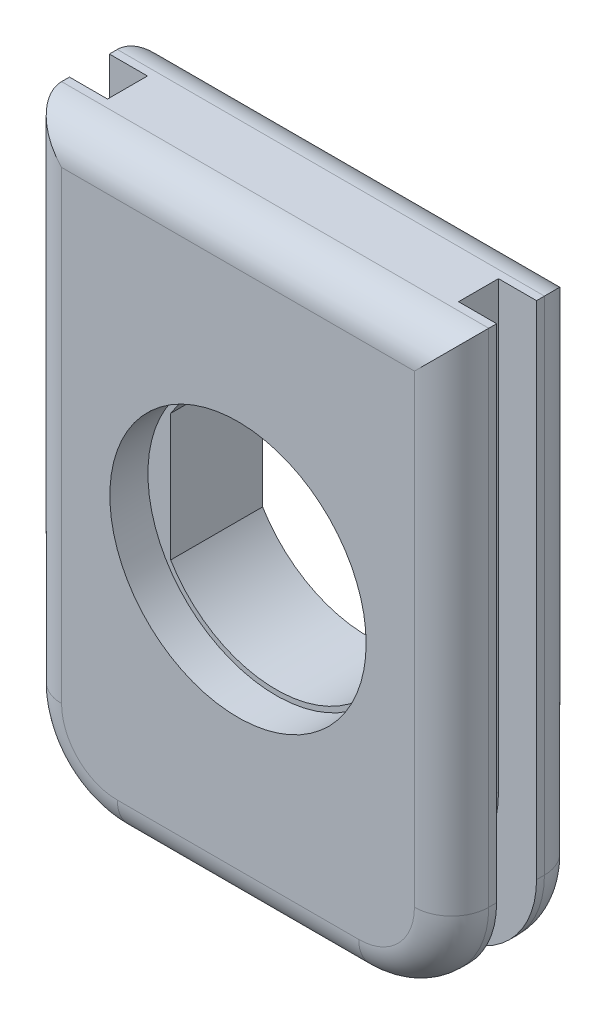
ISO-10303-21;
HEADER;
FILE_DESCRIPTION(('STEP AP214'),'2;1');
FILE_NAME('part.step','',(''),(''),'','','');
FILE_SCHEMA(('AUTOMOTIVE_DESIGN { 1 0 10303 214 1 1 1 1 }'));
ENDSEC;
DATA;
#1=APPLICATION_CONTEXT('core data for automotive mechanical design processes');
#2=APPLICATION_PROTOCOL_DEFINITION('international standard','automotive_design',2000,#1);
#3=PRODUCT_CONTEXT('',#1,'mechanical');
#4=PRODUCT('Part','Part','',(#3));
#5=PRODUCT_RELATED_PRODUCT_CATEGORY('part','',(#4));
#6=PRODUCT_DEFINITION_FORMATION('','',#4);
#7=PRODUCT_DEFINITION_CONTEXT('part definition',#1,'design');
#8=PRODUCT_DEFINITION('design','',#6,#7);
#9=PRODUCT_DEFINITION_SHAPE('','',#8);
#10=(LENGTH_UNIT() NAMED_UNIT(*) SI_UNIT(.MILLI.,.METRE.));
#11=(NAMED_UNIT(*) PLANE_ANGLE_UNIT() SI_UNIT($,.RADIAN.));
#12=(NAMED_UNIT(*) SI_UNIT($,.STERADIAN.) SOLID_ANGLE_UNIT());
#13=UNCERTAINTY_MEASURE_WITH_UNIT(LENGTH_MEASURE(1.E-05),#10,'distance_accuracy_value','');
#14=(GEOMETRIC_REPRESENTATION_CONTEXT(3) GLOBAL_UNCERTAINTY_ASSIGNED_CONTEXT((#13)) GLOBAL_UNIT_ASSIGNED_CONTEXT((#10,
#11,#12)) REPRESENTATION_CONTEXT('',''));
#15=CARTESIAN_POINT('',(0.,0.,0.));
#16=DIRECTION('',(0.,0.,1.));
#17=DIRECTION('',(1.,0.,0.));
#18=AXIS2_PLACEMENT_3D('',#15,#16,#17);
#19=CARTESIAN_POINT('',(0.,0.,-3.5));
#20=DIRECTION('',(0.,0.,1.));
#21=DIRECTION('',(1.,0.,0.));
#22=AXIS2_PLACEMENT_3D('',#19,#20,#21);
#23=CYLINDRICAL_SURFACE('',#22,6.625);
#24=CARTESIAN_POINT('',(0.,0.,1.45));
#25=DIRECTION('',(0.,0.,1.));
#26=DIRECTION('',(1.,0.,0.));
#27=AXIS2_PLACEMENT_3D('',#24,#25,#26);
#28=CIRCLE('',#27,6.625);
#29=CARTESIAN_POINT('',(-5.675,3.41833292702744,1.45));
#30=VERTEX_POINT('',#29);
#31=CARTESIAN_POINT('',(5.675,3.41833292702744,1.45));
#32=VERTEX_POINT('',#31);
#33=EDGE_CURVE('E221',#30,#32,#28,.F.);
#34=ORIENTED_EDGE('',*,*,#33,.F.);
#35=DIRECTION('',(0.,0.,1.));
#36=VECTOR('',#35,1.);
#37=CARTESIAN_POINT('',(-5.675,3.41833292702744,-3.5));
#38=LINE('',#37,#36);
#39=CARTESIAN_POINT('',(-5.675,3.41833292702744,-3.5));
#40=VERTEX_POINT('',#39);
#41=EDGE_CURVE('E228',#40,#30,#38,.T.);
#42=ORIENTED_EDGE('',*,*,#41,.F.);
#43=CARTESIAN_POINT('',(0.,0.,-3.5));
#44=DIRECTION('',(0.,0.,1.));
#45=DIRECTION('',(1.,0.,0.));
#46=AXIS2_PLACEMENT_3D('',#43,#44,#45);
#47=CIRCLE('',#46,6.625);
#48=CARTESIAN_POINT('',(5.675,3.41833292702744,-3.5));
#49=VERTEX_POINT('',#48);
#50=EDGE_CURVE('E231',#49,#40,#47,.T.);
#51=ORIENTED_EDGE('',*,*,#50,.F.);
#52=DIRECTION('',(0.,0.,1.));
#53=VECTOR('',#52,1.);
#54=CARTESIAN_POINT('',(5.675,3.41833292702744,-3.5));
#55=LINE('',#54,#53);
#56=EDGE_CURVE('E230',#49,#32,#55,.T.);
#57=ORIENTED_EDGE('',*,*,#56,.T.);
#58=EDGE_LOOP('',(#34,#42,#51,#57));
#59=FACE_BOUND('',#58,.T.);
#60=ADVANCED_FACE('F37',(#59),#23,.F.);
#61=CARTESIAN_POINT('',(5.675,3.41833292702744,-3.5));
#62=DIRECTION('',(1.,0.,0.));
#63=DIRECTION('',(0.,0.,-1.));
#64=AXIS2_PLACEMENT_3D('',#61,#62,#63);
#65=PLANE('',#64);
#66=DIRECTION('',(0.,-1.,0.));
#67=VECTOR('',#66,1.);
#68=CARTESIAN_POINT('',(5.675,3.41833292702744,1.45));
#69=LINE('',#68,#67);
#70=CARTESIAN_POINT('',(5.675,-3.41833292702744,1.45));
#71=VERTEX_POINT('',#70);
#72=EDGE_CURVE('E232',#32,#71,#69,.T.);
#73=ORIENTED_EDGE('',*,*,#72,.F.);
#74=ORIENTED_EDGE('',*,*,#56,.F.);
#75=DIRECTION('',(0.,1.,0.));
#76=VECTOR('',#75,1.);
#77=CARTESIAN_POINT('',(5.675,3.41833292702744,-3.5));
#78=LINE('',#77,#76);
#79=CARTESIAN_POINT('',(5.675,-3.41833292702744,-3.5));
#80=VERTEX_POINT('',#79);
#81=EDGE_CURVE('E239',#80,#49,#78,.T.);
#82=ORIENTED_EDGE('',*,*,#81,.F.);
#83=DIRECTION('',(0.,0.,1.));
#84=VECTOR('',#83,1.);
#85=CARTESIAN_POINT('',(5.675,-3.41833292702744,-3.5));
#86=LINE('',#85,#84);
#87=EDGE_CURVE('E241',#80,#71,#86,.T.);
#88=ORIENTED_EDGE('',*,*,#87,.T.);
#89=EDGE_LOOP('',(#73,#74,#82,#88));
#90=FACE_BOUND('',#89,.T.);
#91=ADVANCED_FACE('F493',(#90),#65,.F.);
#92=CARTESIAN_POINT('',(0.,0.,-3.5));
#93=DIRECTION('',(0.,0.,1.));
#94=DIRECTION('',(1.,0.,0.));
#95=AXIS2_PLACEMENT_3D('',#92,#93,#94);
#96=CYLINDRICAL_SURFACE('',#95,6.625);
#97=CARTESIAN_POINT('',(0.,0.,1.45));
#98=DIRECTION('',(0.,0.,1.));
#99=DIRECTION('',(1.,0.,0.));
#100=AXIS2_PLACEMENT_3D('',#97,#98,#99);
#101=CIRCLE('',#100,6.625);
#102=CARTESIAN_POINT('',(-5.675,-3.41833292702744,1.45));
#103=VERTEX_POINT('',#102);
#104=EDGE_CURVE('E51',#71,#103,#101,.F.);
#105=ORIENTED_EDGE('',*,*,#104,.F.);
#106=ORIENTED_EDGE('',*,*,#87,.F.);
#107=CARTESIAN_POINT('',(0.,0.,-3.5));
#108=DIRECTION('',(0.,0.,1.));
#109=DIRECTION('',(1.,0.,0.));
#110=AXIS2_PLACEMENT_3D('',#107,#108,#109);
#111=CIRCLE('',#110,6.625);
#112=CARTESIAN_POINT('',(-5.675,-3.41833292702744,-3.5));
#113=VERTEX_POINT('',#112);
#114=EDGE_CURVE('E59',#113,#80,#111,.T.);
#115=ORIENTED_EDGE('',*,*,#114,.F.);
#116=DIRECTION('',(0.,0.,1.));
#117=VECTOR('',#116,1.);
#118=CARTESIAN_POINT('',(-5.675,-3.41833292702744,-3.5));
#119=LINE('',#118,#117);
#120=EDGE_CURVE('E238',#113,#103,#119,.T.);
#121=ORIENTED_EDGE('',*,*,#120,.T.);
#122=EDGE_LOOP('',(#105,#106,#115,#121));
#123=FACE_BOUND('',#122,.T.);
#124=ADVANCED_FACE('F498',(#123),#96,.F.);
#125=CARTESIAN_POINT('',(-5.675,3.41833292702744,-3.5));
#126=DIRECTION('',(-1.,0.,0.));
#127=DIRECTION('',(0.,0.,1.));
#128=AXIS2_PLACEMENT_3D('',#125,#126,#127);
#129=PLANE('',#128);
#130=DIRECTION('',(0.,1.,0.));
#131=VECTOR('',#130,1.);
#132=CARTESIAN_POINT('',(-5.675,3.41833292702744,1.45));
#133=LINE('',#132,#131);
#134=EDGE_CURVE('E11',#103,#30,#133,.T.);
#135=ORIENTED_EDGE('',*,*,#134,.F.);
#136=ORIENTED_EDGE('',*,*,#120,.F.);
#137=DIRECTION('',(0.,-1.,0.));
#138=VECTOR('',#137,1.);
#139=CARTESIAN_POINT('',(-5.675,3.41833292702744,-3.5));
#140=LINE('',#139,#138);
#141=EDGE_CURVE('E236',#40,#113,#140,.T.);
#142=ORIENTED_EDGE('',*,*,#141,.F.);
#143=ORIENTED_EDGE('',*,*,#41,.T.);
#144=EDGE_LOOP('',(#135,#136,#142,#143));
#145=FACE_BOUND('',#144,.T.);
#146=ADVANCED_FACE('F234',(#145),#129,.F.);
#147=CARTESIAN_POINT('',(-11.5,16.,3.5));
#148=DIRECTION('',(1.,0.,0.));
#149=DIRECTION('',(0.,1.,0.));
#150=AXIS2_PLACEMENT_3D('',#147,#148,#149);
#151=PLANE('',#150);
#152=DIRECTION('',(0.,0.,-1.));
#153=VECTOR('',#152,1.);
#154=CARTESIAN_POINT('',(-11.5,16.,3.5));
#155=LINE('',#154,#153);
#156=CARTESIAN_POINT('',(-11.5,16.,-1.075));
#157=VERTEX_POINT('',#156);
#158=CARTESIAN_POINT('',(-11.5,16.,-1.5));
#159=VERTEX_POINT('',#158);
#160=EDGE_CURVE('E296',#157,#159,#155,.T.);
#161=ORIENTED_EDGE('',*,*,#160,.T.);
#162=DIRECTION('',(0.,-1.,0.));
#163=VECTOR('',#162,1.);
#164=CARTESIAN_POINT('',(-11.5,-11.,-1.5));
#165=LINE('',#164,#163);
#166=CARTESIAN_POINT('',(-11.5,-11.,-1.5));
#167=VERTEX_POINT('',#166);
#168=EDGE_CURVE('E372',#159,#167,#165,.T.);
#169=ORIENTED_EDGE('',*,*,#168,.T.);
#170=DIRECTION('',(0.,0.,-1.));
#171=VECTOR('',#170,1.);
#172=CARTESIAN_POINT('',(-11.5,-11.,3.5));
#173=LINE('',#172,#171);
#174=CARTESIAN_POINT('',(-11.5,-11.,-1.075));
#175=VERTEX_POINT('',#174);
#176=EDGE_CURVE('E326',#167,#175,#173,.F.);
#177=ORIENTED_EDGE('',*,*,#176,.T.);
#178=DIRECTION('',(0.,-1.,0.));
#179=VECTOR('',#178,1.);
#180=CARTESIAN_POINT('',(-11.5,16.,-1.075));
#181=LINE('',#180,#179);
#182=EDGE_CURVE('E247',#157,#175,#181,.T.);
#183=ORIENTED_EDGE('',*,*,#182,.F.);
#184=EDGE_LOOP('',(#161,#169,#177,#183));
#185=FACE_BOUND('',#184,.T.);
#186=ADVANCED_FACE('F542',(#185),#151,.F.);
#187=CARTESIAN_POINT('',(11.5,-16.,3.5));
#188=DIRECTION('',(0.,1.,0.));
#189=DIRECTION('',(0.,0.,1.));
#190=AXIS2_PLACEMENT_3D('',#187,#188,#189);
#191=PLANE('',#190);
#192=DIRECTION('',(0.,0.,-1.));
#193=VECTOR('',#192,1.);
#194=CARTESIAN_POINT('',(-6.5,-16.,3.5));
#195=LINE('',#194,#193);
#196=CARTESIAN_POINT('',(-6.5,-16.,-1.075));
#197=VERTEX_POINT('',#196);
#198=CARTESIAN_POINT('',(-6.5,-16.,-1.5));
#199=VERTEX_POINT('',#198);
#200=EDGE_CURVE('E323',#197,#199,#195,.T.);
#201=ORIENTED_EDGE('',*,*,#200,.T.);
#202=DIRECTION('',(1.,0.,0.));
#203=VECTOR('',#202,1.);
#204=CARTESIAN_POINT('',(6.50000000000001,-16.,-1.5));
#205=LINE('',#204,#203);
#206=CARTESIAN_POINT('',(6.50000000000001,-16.,-1.5));
#207=VERTEX_POINT('',#206);
#208=EDGE_CURVE('E376',#199,#207,#205,.T.);
#209=ORIENTED_EDGE('',*,*,#208,.T.);
#210=DIRECTION('',(0.,0.,-1.));
#211=VECTOR('',#210,1.);
#212=CARTESIAN_POINT('',(6.50000000000001,-16.,3.5));
#213=LINE('',#212,#211);
#214=CARTESIAN_POINT('',(6.50000000000001,-16.,-1.075));
#215=VERTEX_POINT('',#214);
#216=EDGE_CURVE('E321',#207,#215,#213,.F.);
#217=ORIENTED_EDGE('',*,*,#216,.T.);
#218=DIRECTION('',(1.,0.,0.));
#219=VECTOR('',#218,1.);
#220=CARTESIAN_POINT('',(-11.5,-16.,-1.075));
#221=LINE('',#220,#219);
#222=EDGE_CURVE('E250',#197,#215,#221,.T.);
#223=ORIENTED_EDGE('',*,*,#222,.F.);
#224=EDGE_LOOP('',(#201,#209,#217,#223));
#225=FACE_BOUND('',#224,.T.);
#226=ADVANCED_FACE('F538',(#225),#191,.F.);
#227=CARTESIAN_POINT('',(11.5,16.,3.5));
#228=DIRECTION('',(-1.,0.,0.));
#229=DIRECTION('',(0.,-1.,0.));
#230=AXIS2_PLACEMENT_3D('',#227,#228,#229);
#231=PLANE('',#230);
#232=DIRECTION('',(0.,0.,-1.));
#233=VECTOR('',#232,1.);
#234=CARTESIAN_POINT('',(11.5,-11.,3.5));
#235=LINE('',#234,#233);
#236=CARTESIAN_POINT('',(11.5,-11.,-1.075));
#237=VERTEX_POINT('',#236);
#238=CARTESIAN_POINT('',(11.5,-11.,-1.5));
#239=VERTEX_POINT('',#238);
#240=EDGE_CURVE('E346',#237,#239,#235,.T.);
#241=ORIENTED_EDGE('',*,*,#240,.T.);
#242=DIRECTION('',(0.,1.,0.));
#243=VECTOR('',#242,1.);
#244=CARTESIAN_POINT('',(11.5,16.,-1.5));
#245=LINE('',#244,#243);
#246=CARTESIAN_POINT('',(11.5,16.,-1.5));
#247=VERTEX_POINT('',#246);
#248=EDGE_CURVE('E365',#239,#247,#245,.T.);
#249=ORIENTED_EDGE('',*,*,#248,.T.);
#250=DIRECTION('',(0.,0.,-1.));
#251=VECTOR('',#250,1.);
#252=CARTESIAN_POINT('',(11.5,16.,3.5));
#253=LINE('',#252,#251);
#254=CARTESIAN_POINT('',(11.5,16.,-1.075));
#255=VERTEX_POINT('',#254);
#256=EDGE_CURVE('E300',#255,#247,#253,.T.);
#257=ORIENTED_EDGE('',*,*,#256,.F.);
#258=DIRECTION('',(0.,1.,0.));
#259=VECTOR('',#258,1.);
#260=CARTESIAN_POINT('',(11.5,-16.,-1.075));
#261=LINE('',#260,#259);
#262=EDGE_CURVE('E254',#237,#255,#261,.T.);
#263=ORIENTED_EDGE('',*,*,#262,.F.);
#264=EDGE_LOOP('',(#241,#249,#257,#263));
#265=FACE_BOUND('',#264,.T.);
#266=ADVANCED_FACE('F533',(#265),#231,.F.);
#267=CARTESIAN_POINT('',(11.5,16.,3.5));
#268=DIRECTION('',(0.,-1.,0.));
#269=DIRECTION('',(0.,0.,-1.));
#270=AXIS2_PLACEMENT_3D('',#267,#268,#269);
#271=PLANE('',#270);
#272=ORIENTED_EDGE('',*,*,#256,.T.);
#273=DIRECTION('',(-1.,0.,0.));
#274=VECTOR('',#273,1.);
#275=CARTESIAN_POINT('',(-11.5,16.,-1.5));
#276=LINE('',#275,#274);
#277=EDGE_CURVE('E370',#247,#159,#276,.T.);
#278=ORIENTED_EDGE('',*,*,#277,.T.);
#279=ORIENTED_EDGE('',*,*,#160,.F.);
#280=DIRECTION('',(-1.,0.,0.));
#281=VECTOR('',#280,1.);
#282=CARTESIAN_POINT('',(-9.45,16.,-1.075));
#283=LINE('',#282,#281);
#284=CARTESIAN_POINT('',(-9.45,16.,-1.075));
#285=VERTEX_POINT('',#284);
#286=EDGE_CURVE('E267',#285,#157,#283,.T.);
#287=ORIENTED_EDGE('',*,*,#286,.F.);
#288=DIRECTION('',(0.,0.,1.));
#289=VECTOR('',#288,1.);
#290=CARTESIAN_POINT('',(-9.45,16.,-1.075));
#291=LINE('',#290,#289);
#292=CARTESIAN_POINT('',(-9.45,16.,1.075));
#293=VERTEX_POINT('',#292);
#294=EDGE_CURVE('E293',#285,#293,#291,.T.);
#295=ORIENTED_EDGE('',*,*,#294,.T.);
#296=DIRECTION('',(-1.,0.,0.));
#297=VECTOR('',#296,1.);
#298=CARTESIAN_POINT('',(-9.45,16.,1.075));
#299=LINE('',#298,#297);
#300=CARTESIAN_POINT('',(-11.5,16.,1.075));
#301=VERTEX_POINT('',#300);
#302=EDGE_CURVE('E251',#293,#301,#299,.T.);
#303=ORIENTED_EDGE('',*,*,#302,.T.);
#304=CARTESIAN_POINT('',(-11.5,16.,1.5));
#305=VERTEX_POINT('',#304);
#306=EDGE_CURVE('E298',#305,#301,#155,.T.);
#307=ORIENTED_EDGE('',*,*,#306,.F.);
#308=DIRECTION('',(-1.,0.,0.));
#309=VECTOR('',#308,1.);
#310=CARTESIAN_POINT('',(11.5,16.,1.5));
#311=LINE('',#310,#309);
#312=CARTESIAN_POINT('',(11.5,16.,1.5));
#313=VERTEX_POINT('',#312);
#314=EDGE_CURVE('E367',#305,#313,#311,.F.);
#315=ORIENTED_EDGE('',*,*,#314,.T.);
#316=CARTESIAN_POINT('',(11.5,16.,1.075));
#317=VERTEX_POINT('',#316);
#318=EDGE_CURVE('E301',#313,#317,#253,.T.);
#319=ORIENTED_EDGE('',*,*,#318,.T.);
#320=DIRECTION('',(-1.,0.,0.));
#321=VECTOR('',#320,1.);
#322=CARTESIAN_POINT('',(9.45,16.,1.075));
#323=LINE('',#322,#321);
#324=CARTESIAN_POINT('',(9.45,16.,1.075));
#325=VERTEX_POINT('',#324);
#326=EDGE_CURVE('E280',#317,#325,#323,.T.);
#327=ORIENTED_EDGE('',*,*,#326,.T.);
#328=DIRECTION('',(0.,0.,1.));
#329=VECTOR('',#328,1.);
#330=CARTESIAN_POINT('',(9.45,16.,-1.075));
#331=LINE('',#330,#329);
#332=CARTESIAN_POINT('',(9.45,16.,-1.075));
#333=VERTEX_POINT('',#332);
#334=EDGE_CURVE('E269',#333,#325,#331,.T.);
#335=ORIENTED_EDGE('',*,*,#334,.F.);
#336=DIRECTION('',(-1.,0.,0.));
#337=VECTOR('',#336,1.);
#338=CARTESIAN_POINT('',(9.45,16.,-1.075));
#339=LINE('',#338,#337);
#340=EDGE_CURVE('E256',#255,#333,#339,.T.);
#341=ORIENTED_EDGE('',*,*,#340,.F.);
#342=EDGE_LOOP('',(#272,#278,#279,#287,#295,#303,#307,#315,#319,#327,#335,#341));
#343=FACE_BOUND('',#342,.T.);
#344=ADVANCED_FACE('F471',(#343),#271,.F.);
#345=DIRECTION('',(0.,0.,-1.));
#346=VECTOR('',#345,1.);
#347=CARTESIAN_POINT('',(-11.5,-11.,3.5));
#348=LINE('',#347,#346);
#349=CARTESIAN_POINT('',(-11.5,-11.,1.075));
#350=VERTEX_POINT('',#349);
#351=CARTESIAN_POINT('',(-11.5,-11.,1.5));
#352=VERTEX_POINT('',#351);
#353=EDGE_CURVE('E341',#350,#352,#348,.F.);
#354=ORIENTED_EDGE('',*,*,#353,.T.);
#355=DIRECTION('',(0.,-1.,0.));
#356=VECTOR('',#355,1.);
#357=CARTESIAN_POINT('',(-11.5,16.,1.5));
#358=LINE('',#357,#356);
#359=EDGE_CURVE('E45',#352,#305,#358,.F.);
#360=ORIENTED_EDGE('',*,*,#359,.T.);
#361=ORIENTED_EDGE('',*,*,#306,.T.);
#362=DIRECTION('',(0.,-1.,0.));
#363=VECTOR('',#362,1.);
#364=CARTESIAN_POINT('',(-11.5,16.,1.075));
#365=LINE('',#364,#363);
#366=EDGE_CURVE('E270',#301,#350,#365,.T.);
#367=ORIENTED_EDGE('',*,*,#366,.T.);
#368=EDGE_LOOP('',(#354,#360,#361,#367));
#369=FACE_BOUND('',#368,.T.);
#370=ADVANCED_FACE('F532',(#369),#151,.F.);
#371=DIRECTION('',(0.,0.,-1.));
#372=VECTOR('',#371,1.);
#373=CARTESIAN_POINT('',(6.50000000000001,-16.,3.5));
#374=LINE('',#373,#372);
#375=CARTESIAN_POINT('',(6.50000000000001,-16.,1.075));
#376=VERTEX_POINT('',#375);
#377=CARTESIAN_POINT('',(6.50000000000001,-16.,1.5));
#378=VERTEX_POINT('',#377);
#379=EDGE_CURVE('E332',#376,#378,#374,.F.);
#380=ORIENTED_EDGE('',*,*,#379,.T.);
#381=DIRECTION('',(1.,0.,0.));
#382=VECTOR('',#381,1.);
#383=CARTESIAN_POINT('',(11.5,-16.,1.5));
#384=LINE('',#383,#382);
#385=CARTESIAN_POINT('',(-6.5,-16.,1.5));
#386=VERTEX_POINT('',#385);
#387=EDGE_CURVE('E395',#378,#386,#384,.F.);
#388=ORIENTED_EDGE('',*,*,#387,.T.);
#389=DIRECTION('',(0.,0.,-1.));
#390=VECTOR('',#389,1.);
#391=CARTESIAN_POINT('',(-6.5,-16.,3.5));
#392=LINE('',#391,#390);
#393=CARTESIAN_POINT('',(-6.5,-16.,1.075));
#394=VERTEX_POINT('',#393);
#395=EDGE_CURVE('E335',#386,#394,#392,.T.);
#396=ORIENTED_EDGE('',*,*,#395,.T.);
#397=DIRECTION('',(1.,0.,0.));
#398=VECTOR('',#397,1.);
#399=CARTESIAN_POINT('',(-11.5,-16.,1.075));
#400=LINE('',#399,#398);
#401=EDGE_CURVE('E273',#394,#376,#400,.T.);
#402=ORIENTED_EDGE('',*,*,#401,.T.);
#403=EDGE_LOOP('',(#380,#388,#396,#402));
#404=FACE_BOUND('',#403,.T.);
#405=ADVANCED_FACE('F442',(#404),#191,.F.);
#406=ORIENTED_EDGE('',*,*,#318,.F.);
#407=DIRECTION('',(0.,1.,0.));
#408=VECTOR('',#407,1.);
#409=CARTESIAN_POINT('',(11.5,16.,1.5));
#410=LINE('',#409,#408);
#411=CARTESIAN_POINT('',(11.5,-11.,1.5));
#412=VERTEX_POINT('',#411);
#413=EDGE_CURVE('E391',#313,#412,#410,.F.);
#414=ORIENTED_EDGE('',*,*,#413,.T.);
#415=DIRECTION('',(0.,0.,-1.));
#416=VECTOR('',#415,1.);
#417=CARTESIAN_POINT('',(11.5,-11.,3.5));
#418=LINE('',#417,#416);
#419=CARTESIAN_POINT('',(11.5,-11.,1.075));
#420=VERTEX_POINT('',#419);
#421=EDGE_CURVE('E344',#412,#420,#418,.T.);
#422=ORIENTED_EDGE('',*,*,#421,.T.);
#423=DIRECTION('',(0.,1.,0.));
#424=VECTOR('',#423,1.);
#425=CARTESIAN_POINT('',(11.5,-16.,1.075));
#426=LINE('',#425,#424);
#427=EDGE_CURVE('E277',#420,#317,#426,.T.);
#428=ORIENTED_EDGE('',*,*,#427,.T.);
#429=EDGE_LOOP('',(#406,#414,#422,#428));
#430=FACE_BOUND('',#429,.T.);
#431=ADVANCED_FACE('F459',(#430),#231,.F.);
#432=CARTESIAN_POINT('',(0.,0.,3.5));
#433=DIRECTION('',(0.,0.,-1.));
#434=DIRECTION('',(-1.,0.,0.));
#435=AXIS2_PLACEMENT_3D('',#432,#433,#434);
#436=PLANE('',#435);
#437=CARTESIAN_POINT('',(0.,0.,3.5));
#438=DIRECTION('',(0.,0.,1.));
#439=DIRECTION('',(1.,0.,0.));
#440=AXIS2_PLACEMENT_3D('',#437,#438,#439);
#441=CIRCLE('',#440,6.9);
#442=CARTESIAN_POINT('',(6.9,0.,3.5));
#443=VERTEX_POINT('',#442);
#444=EDGE_CURVE('E894',#443,#443,#441,.T.);
#445=ORIENTED_EDGE('',*,*,#444,.F.);
#446=EDGE_LOOP('',(#445));
#447=FACE_BOUND('',#446,.T.);
#448=DIRECTION('',(0.,1.,0.));
#449=VECTOR('',#448,1.);
#450=CARTESIAN_POINT('',(9.5,0.,3.5));
#451=LINE('',#450,#449);
#452=CARTESIAN_POINT('',(9.50000000000001,-11.,3.5));
#453=VERTEX_POINT('',#452);
#454=CARTESIAN_POINT('',(9.5,14.,3.5));
#455=VERTEX_POINT('',#454);
#456=EDGE_CURVE('E386',#453,#455,#451,.T.);
#457=ORIENTED_EDGE('',*,*,#456,.T.);
#458=DIRECTION('',(-1.,0.,0.));
#459=VECTOR('',#458,1.);
#460=CARTESIAN_POINT('',(0.,14.,3.5));
#461=LINE('',#460,#459);
#462=CARTESIAN_POINT('',(-9.5,14.,3.5));
#463=VERTEX_POINT('',#462);
#464=EDGE_CURVE('E388',#455,#463,#461,.T.);
#465=ORIENTED_EDGE('',*,*,#464,.T.);
#466=DIRECTION('',(0.,-1.,0.));
#467=VECTOR('',#466,1.);
#468=CARTESIAN_POINT('',(-9.5,0.,3.5));
#469=LINE('',#468,#467);
#470=CARTESIAN_POINT('',(-9.5,-11.,3.5));
#471=VERTEX_POINT('',#470);
#472=EDGE_CURVE('E378',#463,#471,#469,.T.);
#473=ORIENTED_EDGE('',*,*,#472,.T.);
#474=CARTESIAN_POINT('',(-6.5,-11.,3.5));
#475=DIRECTION('',(0.,0.,-1.));
#476=DIRECTION('',(-1.,0.,0.));
#477=AXIS2_PLACEMENT_3D('',#474,#475,#476);
#478=CIRCLE('',#477,3.);
#479=CARTESIAN_POINT('',(-6.5,-14.,3.5));
#480=VERTEX_POINT('',#479);
#481=EDGE_CURVE('E380',#471,#480,#478,.F.);
#482=ORIENTED_EDGE('',*,*,#481,.T.);
#483=DIRECTION('',(1.,0.,0.));
#484=VECTOR('',#483,1.);
#485=CARTESIAN_POINT('',(0.,-14.,3.5));
#486=LINE('',#485,#484);
#487=CARTESIAN_POINT('',(6.50000000000001,-14.,3.5));
#488=VERTEX_POINT('',#487);
#489=EDGE_CURVE('E382',#480,#488,#486,.T.);
#490=ORIENTED_EDGE('',*,*,#489,.T.);
#491=CARTESIAN_POINT('',(6.50000000000001,-11.,3.5));
#492=DIRECTION('',(0.,0.,-1.));
#493=DIRECTION('',(-1.,0.,0.));
#494=AXIS2_PLACEMENT_3D('',#491,#492,#493);
#495=CIRCLE('',#494,3.);
#496=EDGE_CURVE('E384',#488,#453,#495,.F.);
#497=ORIENTED_EDGE('',*,*,#496,.T.);
#498=EDGE_LOOP('',(#457,#465,#473,#482,#490,#497));
#499=FACE_BOUND('',#498,.T.);
#500=ADVANCED_FACE('F482',(#447,#499),#436,.F.);
#501=CARTESIAN_POINT('',(0.,0.,-3.5));
#502=DIRECTION('',(0.,0.,-1.));
#503=DIRECTION('',(-1.,0.,0.));
#504=AXIS2_PLACEMENT_3D('',#501,#502,#503);
#505=PLANE('',#504);
#506=ORIENTED_EDGE('',*,*,#50,.T.);
#507=ORIENTED_EDGE('',*,*,#141,.T.);
#508=ORIENTED_EDGE('',*,*,#114,.T.);
#509=ORIENTED_EDGE('',*,*,#81,.T.);
#510=EDGE_LOOP('',(#506,#507,#508,#509));
#511=FACE_BOUND('',#510,.T.);
#512=DIRECTION('',(0.,1.,0.));
#513=VECTOR('',#512,1.);
#514=CARTESIAN_POINT('',(9.50000000000001,-11.,-3.5));
#515=LINE('',#514,#513);
#516=CARTESIAN_POINT('',(9.5,14.,-3.5));
#517=VERTEX_POINT('',#516);
#518=CARTESIAN_POINT('',(9.50000000000001,-11.,-3.5));
#519=VERTEX_POINT('',#518);
#520=EDGE_CURVE('E357',#517,#519,#515,.F.);
#521=ORIENTED_EDGE('',*,*,#520,.T.);
#522=CARTESIAN_POINT('',(6.50000000000001,-11.,-3.5));
#523=DIRECTION('',(0.,0.,-1.));
#524=DIRECTION('',(-1.,0.,0.));
#525=AXIS2_PLACEMENT_3D('',#522,#523,#524);
#526=CIRCLE('',#525,3.);
#527=CARTESIAN_POINT('',(6.50000000000001,-14.,-3.5));
#528=VERTEX_POINT('',#527);
#529=EDGE_CURVE('E359',#519,#528,#526,.T.);
#530=ORIENTED_EDGE('',*,*,#529,.T.);
#531=DIRECTION('',(1.,0.,0.));
#532=VECTOR('',#531,1.);
#533=CARTESIAN_POINT('',(-6.5,-14.,-3.5));
#534=LINE('',#533,#532);
#535=CARTESIAN_POINT('',(-6.5,-14.,-3.5));
#536=VERTEX_POINT('',#535);
#537=EDGE_CURVE('E349',#528,#536,#534,.F.);
#538=ORIENTED_EDGE('',*,*,#537,.T.);
#539=CARTESIAN_POINT('',(-6.5,-11.,-3.5));
#540=DIRECTION('',(0.,0.,-1.));
#541=DIRECTION('',(-1.,0.,0.));
#542=AXIS2_PLACEMENT_3D('',#539,#540,#541);
#543=CIRCLE('',#542,3.);
#544=CARTESIAN_POINT('',(-9.49999999999999,-11.,-3.5));
#545=VERTEX_POINT('',#544);
#546=EDGE_CURVE('E351',#536,#545,#543,.T.);
#547=ORIENTED_EDGE('',*,*,#546,.T.);
#548=DIRECTION('',(0.,-1.,0.));
#549=VECTOR('',#548,1.);
#550=CARTESIAN_POINT('',(-9.5,16.,-3.5));
#551=LINE('',#550,#549);
#552=CARTESIAN_POINT('',(-9.5,14.,-3.5));
#553=VERTEX_POINT('',#552);
#554=EDGE_CURVE('E353',#545,#553,#551,.F.);
#555=ORIENTED_EDGE('',*,*,#554,.T.);
#556=DIRECTION('',(-1.,0.,0.));
#557=VECTOR('',#556,1.);
#558=CARTESIAN_POINT('',(11.5,14.,-3.5));
#559=LINE('',#558,#557);
#560=EDGE_CURVE('E355',#553,#517,#559,.F.);
#561=ORIENTED_EDGE('',*,*,#560,.T.);
#562=EDGE_LOOP('',(#521,#530,#538,#547,#555,#561));
#563=FACE_BOUND('',#562,.T.);
#564=ADVANCED_FACE('F516',(#511,#563),#505,.T.);
#565=CARTESIAN_POINT('',(-9.45,16.,-1.075));
#566=DIRECTION('',(1.,0.,0.));
#567=DIRECTION('',(0.,1.,0.));
#568=AXIS2_PLACEMENT_3D('',#565,#566,#567);
#569=PLANE('',#568);
#570=DIRECTION('',(0.,1.,0.));
#571=VECTOR('',#570,1.);
#572=CARTESIAN_POINT('',(-9.45,16.,-1.075));
#573=LINE('',#572,#571);
#574=CARTESIAN_POINT('',(-9.45,-7.95,-1.075));
#575=VERTEX_POINT('',#574);
#576=EDGE_CURVE('E265',#575,#285,#573,.T.);
#577=ORIENTED_EDGE('',*,*,#576,.F.);
#578=DIRECTION('',(0.,0.,1.));
#579=VECTOR('',#578,1.);
#580=CARTESIAN_POINT('',(-9.45,-7.95,-1.075));
#581=LINE('',#580,#579);
#582=CARTESIAN_POINT('',(-9.45,-7.95,1.075));
#583=VERTEX_POINT('',#582);
#584=EDGE_CURVE('E310',#575,#583,#581,.T.);
#585=ORIENTED_EDGE('',*,*,#584,.T.);
#586=DIRECTION('',(0.,1.,0.));
#587=VECTOR('',#586,1.);
#588=CARTESIAN_POINT('',(-9.45,16.,1.075));
#589=LINE('',#588,#587);
#590=EDGE_CURVE('E289',#583,#293,#589,.T.);
#591=ORIENTED_EDGE('',*,*,#590,.T.);
#592=ORIENTED_EDGE('',*,*,#294,.F.);
#593=EDGE_LOOP('',(#577,#585,#591,#592));
#594=FACE_BOUND('',#593,.T.);
#595=ADVANCED_FACE('F512',(#594),#569,.F.);
#596=CARTESIAN_POINT('',(-9.45,-13.95,-1.075));
#597=DIRECTION('',(0.,1.,0.));
#598=DIRECTION('',(0.,0.,1.));
#599=AXIS2_PLACEMENT_3D('',#596,#597,#598);
#600=PLANE('',#599);
#601=DIRECTION('',(-1.,0.,0.));
#602=VECTOR('',#601,1.);
#603=CARTESIAN_POINT('',(-9.45,-13.95,-1.075));
#604=LINE('',#603,#602);
#605=CARTESIAN_POINT('',(3.45000000000001,-13.95,-1.075));
#606=VERTEX_POINT('',#605);
#607=CARTESIAN_POINT('',(-3.45,-13.95,-1.075));
#608=VERTEX_POINT('',#607);
#609=EDGE_CURVE('E262',#606,#608,#604,.T.);
#610=ORIENTED_EDGE('',*,*,#609,.F.);
#611=DIRECTION('',(0.,0.,1.));
#612=VECTOR('',#611,1.);
#613=CARTESIAN_POINT('',(3.45000000000001,-13.95,-1.075));
#614=LINE('',#613,#612);
#615=CARTESIAN_POINT('',(3.45000000000001,-13.95,1.075));
#616=VERTEX_POINT('',#615);
#617=EDGE_CURVE('E305',#606,#616,#614,.T.);
#618=ORIENTED_EDGE('',*,*,#617,.T.);
#619=DIRECTION('',(-1.,0.,0.));
#620=VECTOR('',#619,1.);
#621=CARTESIAN_POINT('',(-9.45,-13.95,1.075));
#622=LINE('',#621,#620);
#623=CARTESIAN_POINT('',(-3.45,-13.95,1.075));
#624=VERTEX_POINT('',#623);
#625=EDGE_CURVE('E286',#616,#624,#622,.T.);
#626=ORIENTED_EDGE('',*,*,#625,.T.);
#627=DIRECTION('',(0.,0.,1.));
#628=VECTOR('',#627,1.);
#629=CARTESIAN_POINT('',(-3.45,-13.95,-1.075));
#630=LINE('',#629,#628);
#631=EDGE_CURVE('E303',#624,#608,#630,.F.);
#632=ORIENTED_EDGE('',*,*,#631,.T.);
#633=EDGE_LOOP('',(#610,#618,#626,#632));
#634=FACE_BOUND('',#633,.T.);
#635=ADVANCED_FACE('F515',(#634),#600,.F.);
#636=CARTESIAN_POINT('',(9.45000000000001,-13.95,-1.075));
#637=DIRECTION('',(-1.,0.,0.));
#638=DIRECTION('',(0.,-1.,0.));
#639=AXIS2_PLACEMENT_3D('',#636,#637,#638);
#640=PLANE('',#639);
#641=DIRECTION('',(0.,-1.,0.));
#642=VECTOR('',#641,1.);
#643=CARTESIAN_POINT('',(9.45000000000001,-13.95,1.075));
#644=LINE('',#643,#642);
#645=CARTESIAN_POINT('',(9.45,-7.95,1.075));
#646=VERTEX_POINT('',#645);
#647=EDGE_CURVE('E283',#325,#646,#644,.T.);
#648=ORIENTED_EDGE('',*,*,#647,.T.);
#649=DIRECTION('',(0.,0.,1.));
#650=VECTOR('',#649,1.);
#651=CARTESIAN_POINT('',(9.45,-7.95,-1.075));
#652=LINE('',#651,#650);
#653=CARTESIAN_POINT('',(9.45,-7.95,-1.075));
#654=VERTEX_POINT('',#653);
#655=EDGE_CURVE('E308',#646,#654,#652,.F.);
#656=ORIENTED_EDGE('',*,*,#655,.T.);
#657=DIRECTION('',(0.,-1.,0.));
#658=VECTOR('',#657,1.);
#659=CARTESIAN_POINT('',(9.45000000000001,-13.95,-1.075));
#660=LINE('',#659,#658);
#661=EDGE_CURVE('E259',#333,#654,#660,.T.);
#662=ORIENTED_EDGE('',*,*,#661,.F.);
#663=ORIENTED_EDGE('',*,*,#334,.T.);
#664=EDGE_LOOP('',(#648,#656,#662,#663));
#665=FACE_BOUND('',#664,.T.);
#666=ADVANCED_FACE('F507',(#665),#640,.F.);
#667=CARTESIAN_POINT('',(0.,0.,-1.075));
#668=DIRECTION('',(0.,0.,1.));
#669=DIRECTION('',(1.,0.,0.));
#670=AXIS2_PLACEMENT_3D('',#667,#668,#669);
#671=PLANE('',#670);
#672=ORIENTED_EDGE('',*,*,#182,.T.);
#673=CARTESIAN_POINT('',(-6.5,-11.,-1.075));
#674=DIRECTION('',(0.,0.,1.));
#675=DIRECTION('',(1.,0.,0.));
#676=AXIS2_PLACEMENT_3D('',#673,#674,#675);
#677=CIRCLE('',#676,5.);
#678=EDGE_CURVE('E330',#175,#197,#677,.T.);
#679=ORIENTED_EDGE('',*,*,#678,.T.);
#680=ORIENTED_EDGE('',*,*,#222,.T.);
#681=CARTESIAN_POINT('',(6.50000000000001,-11.,-1.075));
#682=DIRECTION('',(0.,0.,1.));
#683=DIRECTION('',(1.,0.,0.));
#684=AXIS2_PLACEMENT_3D('',#681,#682,#683);
#685=CIRCLE('',#684,5.);
#686=EDGE_CURVE('E328',#215,#237,#685,.T.);
#687=ORIENTED_EDGE('',*,*,#686,.T.);
#688=ORIENTED_EDGE('',*,*,#262,.T.);
#689=ORIENTED_EDGE('',*,*,#340,.T.);
#690=ORIENTED_EDGE('',*,*,#661,.T.);
#691=CARTESIAN_POINT('',(3.45000000000001,-7.95,-1.075));
#692=DIRECTION('',(0.,0.,1.));
#693=DIRECTION('',(1.,0.,0.));
#694=AXIS2_PLACEMENT_3D('',#691,#692,#693);
#695=CIRCLE('',#694,6.);
#696=EDGE_CURVE('E315',#654,#606,#695,.F.);
#697=ORIENTED_EDGE('',*,*,#696,.T.);
#698=ORIENTED_EDGE('',*,*,#609,.T.);
#699=CARTESIAN_POINT('',(-3.45,-7.95,-1.075));
#700=DIRECTION('',(0.,0.,1.));
#701=DIRECTION('',(1.,0.,0.));
#702=AXIS2_PLACEMENT_3D('',#699,#700,#701);
#703=CIRCLE('',#702,6.);
#704=EDGE_CURVE('E319',#608,#575,#703,.F.);
#705=ORIENTED_EDGE('',*,*,#704,.T.);
#706=ORIENTED_EDGE('',*,*,#576,.T.);
#707=ORIENTED_EDGE('',*,*,#286,.T.);
#708=EDGE_LOOP('',(#672,#679,#680,#687,#688,#689,#690,#697,#698,#705,#706,#707));
#709=FACE_BOUND('',#708,.T.);
#710=ADVANCED_FACE('F504',(#709),#671,.T.);
#711=CARTESIAN_POINT('',(0.,0.,1.075));
#712=DIRECTION('',(0.,0.,1.));
#713=DIRECTION('',(1.,0.,0.));
#714=AXIS2_PLACEMENT_3D('',#711,#712,#713);
#715=PLANE('',#714);
#716=ORIENTED_EDGE('',*,*,#401,.F.);
#717=CARTESIAN_POINT('',(-6.5,-11.,1.075));
#718=DIRECTION('',(0.,0.,1.));
#719=DIRECTION('',(1.,0.,0.));
#720=AXIS2_PLACEMENT_3D('',#717,#718,#719);
#721=CIRCLE('',#720,5.);
#722=EDGE_CURVE('E339',#394,#350,#721,.F.);
#723=ORIENTED_EDGE('',*,*,#722,.T.);
#724=ORIENTED_EDGE('',*,*,#366,.F.);
#725=ORIENTED_EDGE('',*,*,#302,.F.);
#726=ORIENTED_EDGE('',*,*,#590,.F.);
#727=CARTESIAN_POINT('',(-3.45,-7.95,1.075));
#728=DIRECTION('',(0.,0.,1.));
#729=DIRECTION('',(1.,0.,0.));
#730=AXIS2_PLACEMENT_3D('',#727,#728,#729);
#731=CIRCLE('',#730,6.);
#732=EDGE_CURVE('E317',#583,#624,#731,.T.);
#733=ORIENTED_EDGE('',*,*,#732,.T.);
#734=ORIENTED_EDGE('',*,*,#625,.F.);
#735=CARTESIAN_POINT('',(3.45000000000001,-7.95,1.075));
#736=DIRECTION('',(0.,0.,1.));
#737=DIRECTION('',(1.,0.,0.));
#738=AXIS2_PLACEMENT_3D('',#735,#736,#737);
#739=CIRCLE('',#738,6.);
#740=EDGE_CURVE('E313',#616,#646,#739,.T.);
#741=ORIENTED_EDGE('',*,*,#740,.T.);
#742=ORIENTED_EDGE('',*,*,#647,.F.);
#743=ORIENTED_EDGE('',*,*,#326,.F.);
#744=ORIENTED_EDGE('',*,*,#427,.F.);
#745=CARTESIAN_POINT('',(6.50000000000001,-11.,1.075));
#746=DIRECTION('',(0.,0.,1.));
#747=DIRECTION('',(1.,0.,0.));
#748=AXIS2_PLACEMENT_3D('',#745,#746,#747);
#749=CIRCLE('',#748,5.);
#750=EDGE_CURVE('E337',#420,#376,#749,.F.);
#751=ORIENTED_EDGE('',*,*,#750,.T.);
#752=EDGE_LOOP('',(#716,#723,#724,#725,#726,#733,#734,#741,#742,#743,#744,#751));
#753=FACE_BOUND('',#752,.T.);
#754=ADVANCED_FACE('F451',(#753),#715,.F.);
#755=CARTESIAN_POINT('',(3.45000000000001,-7.95,-1.075));
#756=DIRECTION('',(0.,0.,1.));
#757=DIRECTION('',(1.,0.,0.));
#758=AXIS2_PLACEMENT_3D('',#755,#756,#757);
#759=CYLINDRICAL_SURFACE('',#758,6.);
#760=ORIENTED_EDGE('',*,*,#696,.F.);
#761=ORIENTED_EDGE('',*,*,#655,.F.);
#762=ORIENTED_EDGE('',*,*,#740,.F.);
#763=ORIENTED_EDGE('',*,*,#617,.F.);
#764=EDGE_LOOP('',(#760,#761,#762,#763));
#765=FACE_BOUND('',#764,.T.);
#766=ADVANCED_FACE('F511',(#765),#759,.T.);
#767=CARTESIAN_POINT('',(-3.45,-7.95,-1.075));
#768=DIRECTION('',(0.,0.,1.));
#769=DIRECTION('',(1.,0.,0.));
#770=AXIS2_PLACEMENT_3D('',#767,#768,#769);
#771=CYLINDRICAL_SURFACE('',#770,6.);
#772=ORIENTED_EDGE('',*,*,#704,.F.);
#773=ORIENTED_EDGE('',*,*,#631,.F.);
#774=ORIENTED_EDGE('',*,*,#732,.F.);
#775=ORIENTED_EDGE('',*,*,#584,.F.);
#776=EDGE_LOOP('',(#772,#773,#774,#775));
#777=FACE_BOUND('',#776,.T.);
#778=ADVANCED_FACE('F545',(#777),#771,.T.);
#779=CARTESIAN_POINT('',(-6.5,-11.,3.5));
#780=DIRECTION('',(0.,0.,-1.));
#781=DIRECTION('',(-1.,0.,0.));
#782=AXIS2_PLACEMENT_3D('',#779,#780,#781);
#783=CYLINDRICAL_SURFACE('',#782,5.);
#784=ORIENTED_EDGE('',*,*,#176,.F.);
#785=CARTESIAN_POINT('',(-6.5,-11.,-1.5));
#786=DIRECTION('',(0.,0.,-1.));
#787=DIRECTION('',(-1.,0.,0.));
#788=AXIS2_PLACEMENT_3D('',#785,#786,#787);
#789=CIRCLE('',#788,5.);
#790=EDGE_CURVE('E374',#167,#199,#789,.F.);
#791=ORIENTED_EDGE('',*,*,#790,.T.);
#792=ORIENTED_EDGE('',*,*,#200,.F.);
#793=ORIENTED_EDGE('',*,*,#678,.F.);
#794=EDGE_LOOP('',(#784,#791,#792,#793));
#795=FACE_BOUND('',#794,.T.);
#796=ADVANCED_FACE('F549',(#795),#783,.T.);
#797=CARTESIAN_POINT('',(-6.5,-11.,3.5));
#798=DIRECTION('',(0.,0.,-1.));
#799=DIRECTION('',(-1.,0.,0.));
#800=AXIS2_PLACEMENT_3D('',#797,#798,#799);
#801=CYLINDRICAL_SURFACE('',#800,5.);
#802=ORIENTED_EDGE('',*,*,#395,.F.);
#803=CARTESIAN_POINT('',(-6.5,-11.,1.5));
#804=DIRECTION('',(0.,0.,-1.));
#805=DIRECTION('',(-1.,0.,0.));
#806=AXIS2_PLACEMENT_3D('',#803,#804,#805);
#807=CIRCLE('',#806,5.);
#808=EDGE_CURVE('E397',#386,#352,#807,.T.);
#809=ORIENTED_EDGE('',*,*,#808,.T.);
#810=ORIENTED_EDGE('',*,*,#353,.F.);
#811=ORIENTED_EDGE('',*,*,#722,.F.);
#812=EDGE_LOOP('',(#802,#809,#810,#811));
#813=FACE_BOUND('',#812,.T.);
#814=ADVANCED_FACE('F446',(#813),#801,.T.);
#815=CARTESIAN_POINT('',(6.50000000000001,-11.,3.5));
#816=DIRECTION('',(0.,0.,-1.));
#817=DIRECTION('',(-1.,0.,0.));
#818=AXIS2_PLACEMENT_3D('',#815,#816,#817);
#819=CYLINDRICAL_SURFACE('',#818,5.);
#820=ORIENTED_EDGE('',*,*,#421,.F.);
#821=CARTESIAN_POINT('',(6.50000000000001,-11.,1.5));
#822=DIRECTION('',(0.,0.,-1.));
#823=DIRECTION('',(-1.,0.,0.));
#824=AXIS2_PLACEMENT_3D('',#821,#822,#823);
#825=CIRCLE('',#824,5.);
#826=EDGE_CURVE('E393',#412,#378,#825,.T.);
#827=ORIENTED_EDGE('',*,*,#826,.T.);
#828=ORIENTED_EDGE('',*,*,#379,.F.);
#829=ORIENTED_EDGE('',*,*,#750,.F.);
#830=EDGE_LOOP('',(#820,#827,#828,#829));
#831=FACE_BOUND('',#830,.T.);
#832=ADVANCED_FACE('F456',(#831),#819,.T.);
#833=CARTESIAN_POINT('',(6.50000000000001,-11.,3.5));
#834=DIRECTION('',(0.,0.,-1.));
#835=DIRECTION('',(-1.,0.,0.));
#836=AXIS2_PLACEMENT_3D('',#833,#834,#835);
#837=CYLINDRICAL_SURFACE('',#836,5.);
#838=ORIENTED_EDGE('',*,*,#216,.F.);
#839=CARTESIAN_POINT('',(6.50000000000001,-11.,-1.5));
#840=DIRECTION('',(0.,0.,-1.));
#841=DIRECTION('',(-1.,0.,0.));
#842=AXIS2_PLACEMENT_3D('',#839,#840,#841);
#843=CIRCLE('',#842,5.);
#844=EDGE_CURVE('E362',#207,#239,#843,.F.);
#845=ORIENTED_EDGE('',*,*,#844,.T.);
#846=ORIENTED_EDGE('',*,*,#240,.F.);
#847=ORIENTED_EDGE('',*,*,#686,.F.);
#848=EDGE_LOOP('',(#838,#845,#846,#847));
#849=FACE_BOUND('',#848,.T.);
#850=ADVANCED_FACE('F558',(#849),#837,.T.);
#851=CARTESIAN_POINT('',(-9.5,16.,-1.5));
#852=DIRECTION('',(0.,1.,0.));
#853=DIRECTION('',(-1.,0.,0.));
#854=AXIS2_PLACEMENT_3D('',#851,#852,#853);
#855=CYLINDRICAL_SURFACE('',#854,2.);
#856=CARTESIAN_POINT('',(-9.5,-11.,-1.5));
#857=DIRECTION('',(0.,-1.,0.));
#858=DIRECTION('',(0.,0.,-1.));
#859=AXIS2_PLACEMENT_3D('',#856,#857,#858);
#860=CIRCLE('',#859,2.);
#861=EDGE_CURVE('E411',#167,#545,#860,.T.);
#862=ORIENTED_EDGE('',*,*,#861,.F.);
#863=ORIENTED_EDGE('',*,*,#168,.F.);
#864=CARTESIAN_POINT('',(-9.5,14.,-1.5));
#865=DIRECTION('',(0.707106781186547,0.707106781186548,0.));
#866=DIRECTION('',(-0.707106781186548,0.707106781186547,0.));
#867=AXIS2_PLACEMENT_3D('',#864,#865,#866);
#868=ELLIPSE('',#867,2.82842712474619,2.);
#869=EDGE_CURVE('E274',#553,#159,#868,.T.);
#870=ORIENTED_EDGE('',*,*,#869,.F.);
#871=ORIENTED_EDGE('',*,*,#554,.F.);
#872=EDGE_LOOP('',(#862,#863,#870,#871));
#873=FACE_BOUND('',#872,.T.);
#874=ADVANCED_FACE('F561',(#873),#855,.T.);
#875=CARTESIAN_POINT('',(11.5,14.,-1.5));
#876=DIRECTION('',(1.,0.,0.));
#877=DIRECTION('',(0.,0.,-1.));
#878=AXIS2_PLACEMENT_3D('',#875,#876,#877);
#879=CYLINDRICAL_SURFACE('',#878,2.);
#880=ORIENTED_EDGE('',*,*,#869,.T.);
#881=ORIENTED_EDGE('',*,*,#277,.F.);
#882=CARTESIAN_POINT('',(9.5,14.,-1.5));
#883=DIRECTION('',(0.707106781186548,-0.707106781186547,0.));
#884=DIRECTION('',(0.707106781186547,0.707106781186548,0.));
#885=AXIS2_PLACEMENT_3D('',#882,#883,#884);
#886=ELLIPSE('',#885,2.82842712474619,2.);
#887=EDGE_CURVE('E408',#517,#247,#886,.T.);
#888=ORIENTED_EDGE('',*,*,#887,.F.);
#889=ORIENTED_EDGE('',*,*,#560,.F.);
#890=EDGE_LOOP('',(#880,#881,#888,#889));
#891=FACE_BOUND('',#890,.T.);
#892=ADVANCED_FACE('F578',(#891),#879,.T.);
#893=CARTESIAN_POINT('',(-6.5,-11.,-1.5));
#894=DIRECTION('',(0.,0.,-1.));
#895=DIRECTION('',(-1.,0.,0.));
#896=AXIS2_PLACEMENT_3D('',#893,#894,#895);
#897=TOROIDAL_SURFACE('',#896,3.,2.);
#898=ORIENTED_EDGE('',*,*,#861,.T.);
#899=ORIENTED_EDGE('',*,*,#546,.F.);
#900=CARTESIAN_POINT('',(-6.5,-14.,-1.5));
#901=DIRECTION('',(1.,0.,0.));
#902=DIRECTION('',(0.,0.,-1.));
#903=AXIS2_PLACEMENT_3D('',#900,#901,#902);
#904=CIRCLE('',#903,2.);
#905=EDGE_CURVE('E405',#199,#536,#904,.T.);
#906=ORIENTED_EDGE('',*,*,#905,.F.);
#907=ORIENTED_EDGE('',*,*,#790,.F.);
#908=EDGE_LOOP('',(#898,#899,#906,#907));
#909=FACE_BOUND('',#908,.T.);
#910=ADVANCED_FACE('F574',(#909),#897,.T.);
#911=CARTESIAN_POINT('',(9.5,16.,-1.5));
#912=DIRECTION('',(0.,-1.,0.));
#913=DIRECTION('',(1.,0.,0.));
#914=AXIS2_PLACEMENT_3D('',#911,#912,#913);
#915=CYLINDRICAL_SURFACE('',#914,2.);
#916=ORIENTED_EDGE('',*,*,#887,.T.);
#917=ORIENTED_EDGE('',*,*,#248,.F.);
#918=CARTESIAN_POINT('',(9.50000000000001,-11.,-1.5));
#919=DIRECTION('',(0.,-1.,0.));
#920=DIRECTION('',(1.,0.,0.));
#921=AXIS2_PLACEMENT_3D('',#918,#919,#920);
#922=CIRCLE('',#921,2.);
#923=EDGE_CURVE('E402',#519,#239,#922,.T.);
#924=ORIENTED_EDGE('',*,*,#923,.F.);
#925=ORIENTED_EDGE('',*,*,#520,.F.);
#926=EDGE_LOOP('',(#916,#917,#924,#925));
#927=FACE_BOUND('',#926,.T.);
#928=ADVANCED_FACE('F570',(#927),#915,.T.);
#929=CARTESIAN_POINT('',(11.5,-14.,-1.5));
#930=DIRECTION('',(-1.,0.,0.));
#931=DIRECTION('',(0.,0.,1.));
#932=AXIS2_PLACEMENT_3D('',#929,#930,#931);
#933=CYLINDRICAL_SURFACE('',#932,2.);
#934=ORIENTED_EDGE('',*,*,#905,.T.);
#935=ORIENTED_EDGE('',*,*,#537,.F.);
#936=CARTESIAN_POINT('',(6.50000000000001,-14.,-1.5));
#937=DIRECTION('',(1.,0.,0.));
#938=DIRECTION('',(0.,0.,-1.));
#939=AXIS2_PLACEMENT_3D('',#936,#937,#938);
#940=CIRCLE('',#939,2.);
#941=EDGE_CURVE('E400',#207,#528,#940,.T.);
#942=ORIENTED_EDGE('',*,*,#941,.F.);
#943=ORIENTED_EDGE('',*,*,#208,.F.);
#944=EDGE_LOOP('',(#934,#935,#942,#943));
#945=FACE_BOUND('',#944,.T.);
#946=ADVANCED_FACE('F566',(#945),#933,.T.);
#947=CARTESIAN_POINT('',(6.50000000000001,-11.,-1.5));
#948=DIRECTION('',(0.,0.,-1.));
#949=DIRECTION('',(-1.,0.,0.));
#950=AXIS2_PLACEMENT_3D('',#947,#948,#949);
#951=TOROIDAL_SURFACE('',#950,3.,2.);
#952=ORIENTED_EDGE('',*,*,#923,.T.);
#953=ORIENTED_EDGE('',*,*,#844,.F.);
#954=ORIENTED_EDGE('',*,*,#941,.T.);
#955=ORIENTED_EDGE('',*,*,#529,.F.);
#956=EDGE_LOOP('',(#952,#953,#954,#955));
#957=FACE_BOUND('',#956,.T.);
#958=ADVANCED_FACE('F563',(#957),#951,.T.);
#959=CARTESIAN_POINT('',(0.,-14.,1.5));
#960=DIRECTION('',(1.,0.,0.));
#961=DIRECTION('',(0.,0.,-1.));
#962=AXIS2_PLACEMENT_3D('',#959,#960,#961);
#963=CYLINDRICAL_SURFACE('',#962,2.);
#964=CARTESIAN_POINT('',(-6.5,-14.,1.5));
#965=DIRECTION('',(-1.,0.,0.));
#966=DIRECTION('',(0.,0.,1.));
#967=AXIS2_PLACEMENT_3D('',#964,#965,#966);
#968=CIRCLE('',#967,2.);
#969=EDGE_CURVE('E426',#386,#480,#968,.T.);
#970=ORIENTED_EDGE('',*,*,#969,.F.);
#971=ORIENTED_EDGE('',*,*,#387,.F.);
#972=CARTESIAN_POINT('',(6.50000000000001,-14.,1.5));
#973=DIRECTION('',(1.,0.,0.));
#974=DIRECTION('',(0.,0.,-1.));
#975=AXIS2_PLACEMENT_3D('',#972,#973,#974);
#976=CIRCLE('',#975,2.);
#977=EDGE_CURVE('E403',#488,#378,#976,.T.);
#978=ORIENTED_EDGE('',*,*,#977,.F.);
#979=ORIENTED_EDGE('',*,*,#489,.F.);
#980=EDGE_LOOP('',(#970,#971,#978,#979));
#981=FACE_BOUND('',#980,.T.);
#982=ADVANCED_FACE('F39',(#981),#963,.T.);
#983=CARTESIAN_POINT('',(6.50000000000001,-11.,1.5));
#984=DIRECTION('',(0.,0.,-1.));
#985=DIRECTION('',(-1.,0.,0.));
#986=AXIS2_PLACEMENT_3D('',#983,#984,#985);
#987=TOROIDAL_SURFACE('',#986,3.,2.);
#988=ORIENTED_EDGE('',*,*,#977,.T.);
#989=ORIENTED_EDGE('',*,*,#826,.F.);
#990=CARTESIAN_POINT('',(9.50000000000001,-11.,1.5));
#991=DIRECTION('',(0.,1.,0.));
#992=DIRECTION('',(0.,0.,1.));
#993=AXIS2_PLACEMENT_3D('',#990,#991,#992);
#994=CIRCLE('',#993,2.);
#995=EDGE_CURVE('E423',#453,#412,#994,.T.);
#996=ORIENTED_EDGE('',*,*,#995,.F.);
#997=ORIENTED_EDGE('',*,*,#496,.F.);
#998=EDGE_LOOP('',(#988,#989,#996,#997));
#999=FACE_BOUND('',#998,.T.);
#1000=ADVANCED_FACE('F433',(#999),#987,.T.);
#1001=CARTESIAN_POINT('',(-6.5,-11.,1.5));
#1002=DIRECTION('',(0.,0.,-1.));
#1003=DIRECTION('',(-1.,0.,0.));
#1004=AXIS2_PLACEMENT_3D('',#1001,#1002,#1003);
#1005=TOROIDAL_SURFACE('',#1004,3.,2.);
#1006=ORIENTED_EDGE('',*,*,#969,.T.);
#1007=ORIENTED_EDGE('',*,*,#481,.F.);
#1008=CARTESIAN_POINT('',(-9.5,-11.,1.5));
#1009=DIRECTION('',(0.,1.,0.));
#1010=DIRECTION('',(-1.,0.,0.));
#1011=AXIS2_PLACEMENT_3D('',#1008,#1009,#1010);
#1012=CIRCLE('',#1011,2.);
#1013=EDGE_CURVE('E420',#352,#471,#1012,.T.);
#1014=ORIENTED_EDGE('',*,*,#1013,.F.);
#1015=ORIENTED_EDGE('',*,*,#808,.F.);
#1016=EDGE_LOOP('',(#1006,#1007,#1014,#1015));
#1017=FACE_BOUND('',#1016,.T.);
#1018=ADVANCED_FACE('F484',(#1017),#1005,.T.);
#1019=CARTESIAN_POINT('',(9.5,0.,1.5));
#1020=DIRECTION('',(0.,1.,0.));
#1021=DIRECTION('',(-1.,0.,0.));
#1022=AXIS2_PLACEMENT_3D('',#1019,#1020,#1021);
#1023=CYLINDRICAL_SURFACE('',#1022,2.);
#1024=ORIENTED_EDGE('',*,*,#995,.T.);
#1025=ORIENTED_EDGE('',*,*,#413,.F.);
#1026=CARTESIAN_POINT('',(9.5,14.,1.5));
#1027=DIRECTION('',(-0.707106781186548,0.707106781186547,0.));
#1028=DIRECTION('',(0.707106781186547,0.707106781186548,0.));
#1029=AXIS2_PLACEMENT_3D('',#1026,#1027,#1028);
#1030=ELLIPSE('',#1029,2.82842712474619,2.);
#1031=EDGE_CURVE('E418',#455,#313,#1030,.T.);
#1032=ORIENTED_EDGE('',*,*,#1031,.F.);
#1033=ORIENTED_EDGE('',*,*,#456,.F.);
#1034=EDGE_LOOP('',(#1024,#1025,#1032,#1033));
#1035=FACE_BOUND('',#1034,.T.);
#1036=ADVANCED_FACE('F464',(#1035),#1023,.T.);
#1037=CARTESIAN_POINT('',(-9.5,0.,1.5));
#1038=DIRECTION('',(0.,-1.,0.));
#1039=DIRECTION('',(1.,0.,0.));
#1040=AXIS2_PLACEMENT_3D('',#1037,#1038,#1039);
#1041=CYLINDRICAL_SURFACE('',#1040,2.);
#1042=ORIENTED_EDGE('',*,*,#1013,.T.);
#1043=ORIENTED_EDGE('',*,*,#472,.F.);
#1044=CARTESIAN_POINT('',(-9.5,14.,1.5));
#1045=DIRECTION('',(-0.707106781186547,-0.707106781186548,0.));
#1046=DIRECTION('',(0.707106781186548,-0.707106781186547,0.));
#1047=AXIS2_PLACEMENT_3D('',#1044,#1045,#1046);
#1048=ELLIPSE('',#1047,2.82842712474619,2.);
#1049=EDGE_CURVE('E416',#305,#463,#1048,.F.);
#1050=ORIENTED_EDGE('',*,*,#1049,.F.);
#1051=ORIENTED_EDGE('',*,*,#359,.F.);
#1052=EDGE_LOOP('',(#1042,#1043,#1050,#1051));
#1053=FACE_BOUND('',#1052,.T.);
#1054=ADVANCED_FACE('F478',(#1053),#1041,.T.);
#1055=CARTESIAN_POINT('',(0.,14.,1.5));
#1056=DIRECTION('',(-1.,0.,0.));
#1057=DIRECTION('',(0.,0.,1.));
#1058=AXIS2_PLACEMENT_3D('',#1055,#1056,#1057);
#1059=CYLINDRICAL_SURFACE('',#1058,2.);
#1060=ORIENTED_EDGE('',*,*,#1031,.T.);
#1061=ORIENTED_EDGE('',*,*,#314,.F.);
#1062=ORIENTED_EDGE('',*,*,#1049,.T.);
#1063=ORIENTED_EDGE('',*,*,#464,.F.);
#1064=EDGE_LOOP('',(#1060,#1061,#1062,#1063));
#1065=FACE_BOUND('',#1064,.T.);
#1066=ADVANCED_FACE('F474',(#1065),#1059,.T.);
#1067=CARTESIAN_POINT('',(0.,0.,1.45));
#1068=DIRECTION('',(0.,0.,1.));
#1069=DIRECTION('',(1.,0.,0.));
#1070=AXIS2_PLACEMENT_3D('',#1067,#1068,#1069);
#1071=PLANE('',#1070);
#1072=CARTESIAN_POINT('',(0.,0.,1.45));
#1073=DIRECTION('',(0.,0.,1.));
#1074=DIRECTION('',(1.,0.,0.));
#1075=AXIS2_PLACEMENT_3D('',#1072,#1073,#1074);
#1076=CIRCLE('',#1075,6.9);
#1077=CARTESIAN_POINT('',(6.9,0.,1.45));
#1078=VERTEX_POINT('',#1077);
#1079=EDGE_CURVE('E886',#1078,#1078,#1076,.T.);
#1080=ORIENTED_EDGE('',*,*,#1079,.T.);
#1081=EDGE_LOOP('',(#1080));
#1082=FACE_BOUND('',#1081,.T.);
#1083=ORIENTED_EDGE('',*,*,#33,.T.);
#1084=ORIENTED_EDGE('',*,*,#72,.T.);
#1085=ORIENTED_EDGE('',*,*,#104,.T.);
#1086=ORIENTED_EDGE('',*,*,#134,.T.);
#1087=EDGE_LOOP('',(#1083,#1084,#1085,#1086));
#1088=FACE_BOUND('',#1087,.T.);
#1089=ADVANCED_FACE('F220',(#1082,#1088),#1071,.T.);
#1090=CARTESIAN_POINT('',(0.,0.,1.45));
#1091=DIRECTION('',(0.,0.,1.));
#1092=DIRECTION('',(1.,0.,0.));
#1093=AXIS2_PLACEMENT_3D('',#1090,#1091,#1092);
#1094=CYLINDRICAL_SURFACE('',#1093,6.9);
#1095=ORIENTED_EDGE('',*,*,#1079,.F.);
#1096=EDGE_LOOP('',(#1095));
#1097=FACE_BOUND('',#1096,.T.);
#1098=ORIENTED_EDGE('',*,*,#444,.T.);
#1099=EDGE_LOOP('',(#1098));
#1100=FACE_BOUND('',#1099,.T.);
#1101=ADVANCED_FACE('F604',(#1097,#1100),#1094,.F.);
#1102=CLOSED_SHELL('',(#60,#91,#124,#146,#186,#226,#266,#344,#370,#405,#431,#500,#564,#595,#635,
#666,#710,#754,#766,#778,#796,#814,#832,#850,#874,#892,#910,#928,#946,#958,#982,#1000,#1018,
#1036,#1054,#1066,#1089,#1101));
#1103=MANIFOLD_SOLID_BREP('B2',#1102);
#1104=ADVANCED_BREP_SHAPE_REPRESENTATION('',(#18,#1103),#14);
#1105=SHAPE_DEFINITION_REPRESENTATION(#9,#1104);
ENDSEC;
END-ISO-10303-21;
